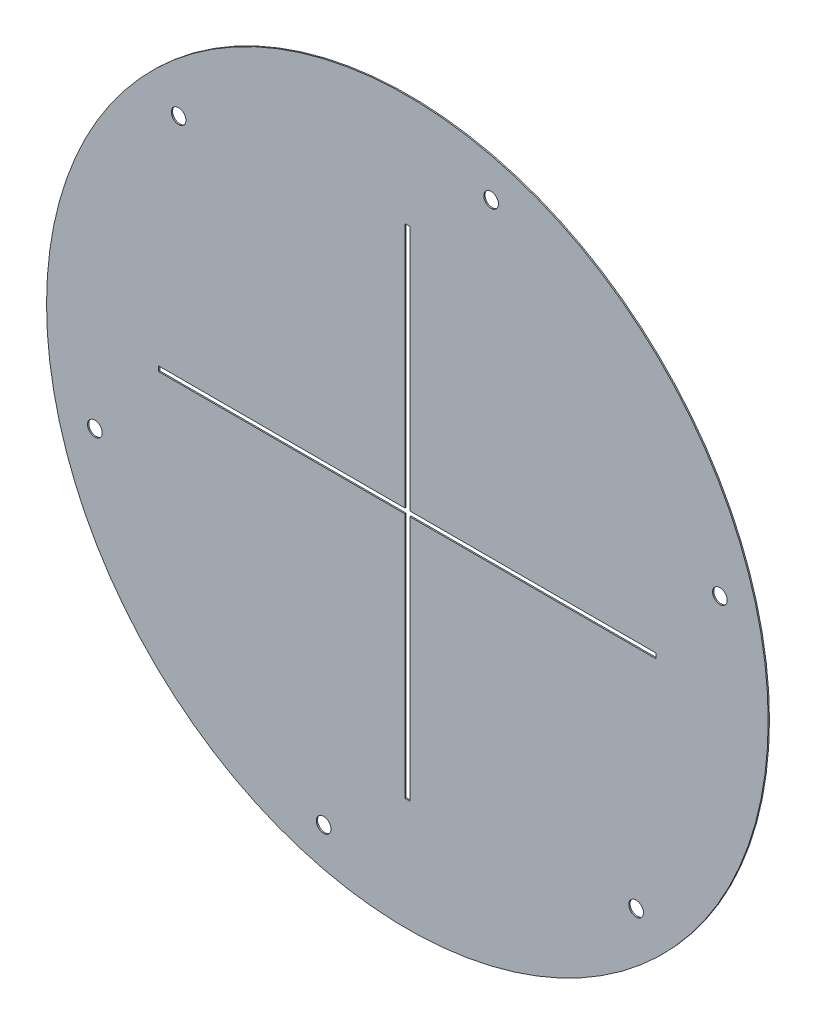
ISO-10303-21;
HEADER;
FILE_DESCRIPTION(('STEP AP214'),'2;1');
FILE_NAME('part.step','',(''),(''),'','','');
FILE_SCHEMA(('AUTOMOTIVE_DESIGN { 1 0 10303 214 1 1 1 1 }'));
ENDSEC;
DATA;
#1=APPLICATION_CONTEXT('core data for automotive mechanical design processes');
#2=APPLICATION_PROTOCOL_DEFINITION('international standard','automotive_design',2000,#1);
#3=PRODUCT_CONTEXT('',#1,'mechanical');
#4=PRODUCT('Part','Part','',(#3));
#5=PRODUCT_RELATED_PRODUCT_CATEGORY('part','',(#4));
#6=PRODUCT_DEFINITION_FORMATION('','',#4);
#7=PRODUCT_DEFINITION_CONTEXT('part definition',#1,'design');
#8=PRODUCT_DEFINITION('design','',#6,#7);
#9=PRODUCT_DEFINITION_SHAPE('','',#8);
#10=(LENGTH_UNIT() NAMED_UNIT(*) SI_UNIT(.MILLI.,.METRE.));
#11=(NAMED_UNIT(*) PLANE_ANGLE_UNIT() SI_UNIT($,.RADIAN.));
#12=(NAMED_UNIT(*) SI_UNIT($,.STERADIAN.) SOLID_ANGLE_UNIT());
#13=UNCERTAINTY_MEASURE_WITH_UNIT(LENGTH_MEASURE(1.E-05),#10,'distance_accuracy_value','');
#14=(GEOMETRIC_REPRESENTATION_CONTEXT(3) GLOBAL_UNCERTAINTY_ASSIGNED_CONTEXT((#13)) GLOBAL_UNIT_ASSIGNED_CONTEXT((#10,
#11,#12)) REPRESENTATION_CONTEXT('',''));
#15=CARTESIAN_POINT('',(0.,0.,0.));
#16=DIRECTION('',(0.,0.,1.));
#17=DIRECTION('',(1.,0.,0.));
#18=AXIS2_PLACEMENT_3D('',#15,#16,#17);
#19=CARTESIAN_POINT('',(0.,0.,0.254));
#20=DIRECTION('',(0.,0.,1.));
#21=DIRECTION('',(1.,0.,0.));
#22=AXIS2_PLACEMENT_3D('',#19,#20,#21);
#23=PLANE('',#22);
#24=CARTESIAN_POINT('',(-45.9619407771256,45.9619407771255,0.254));
#25=DIRECTION('',(0.,0.,1.));
#26=DIRECTION('',(1.,0.,0.));
#27=AXIS2_PLACEMENT_3D('',#24,#25,#26);
#28=CIRCLE('',#27,1.47320000000002);
#29=CARTESIAN_POINT('',(-44.4887407771256,45.9619407771255,0.254));
#30=VERTEX_POINT('',#29);
#31=EDGE_CURVE('E252',#30,#30,#28,.T.);
#32=ORIENTED_EDGE('',*,*,#31,.F.);
#33=EDGE_LOOP('',(#32));
#34=FACE_BOUND('',#33,.T.);
#35=CARTESIAN_POINT('',(-16.8232379316637,-62.7851787087894,0.254));
#36=DIRECTION('',(0.,0.,1.));
#37=DIRECTION('',(1.,0.,0.));
#38=AXIS2_PLACEMENT_3D('',#35,#36,#37);
#39=CIRCLE('',#38,1.47320000000002);
#40=CARTESIAN_POINT('',(-15.3500379316637,-62.7851787087894,0.254));
#41=VERTEX_POINT('',#40);
#42=EDGE_CURVE('E255',#41,#41,#39,.T.);
#43=ORIENTED_EDGE('',*,*,#42,.F.);
#44=EDGE_LOOP('',(#43));
#45=FACE_BOUND('',#44,.T.);
#46=DIRECTION('',(0.,-1.,0.));
#47=VECTOR('',#46,1.);
#48=CARTESIAN_POINT('',(-0.500000000000014,50.,0.254));
#49=LINE('',#48,#47);
#50=CARTESIAN_POINT('',(-0.500000000000014,50.,0.254));
#51=VERTEX_POINT('',#50);
#52=CARTESIAN_POINT('',(-0.499999999999997,0.5,0.254));
#53=VERTEX_POINT('',#52);
#54=EDGE_CURVE('E136',#51,#53,#49,.T.);
#55=ORIENTED_EDGE('',*,*,#54,.F.);
#56=DIRECTION('',(-1.,0.,0.));
#57=VECTOR('',#56,1.);
#58=CARTESIAN_POINT('',(0.499999999999986,50.,0.254));
#59=LINE('',#58,#57);
#60=CARTESIAN_POINT('',(0.499999999999986,50.,0.254));
#61=VERTEX_POINT('',#60);
#62=EDGE_CURVE('E128',#61,#51,#59,.T.);
#63=ORIENTED_EDGE('',*,*,#62,.F.);
#64=DIRECTION('',(0.,1.,0.));
#65=VECTOR('',#64,1.);
#66=CARTESIAN_POINT('',(0.500000000000002,0.499999999999999,0.254));
#67=LINE('',#66,#65);
#68=CARTESIAN_POINT('',(0.500000000000002,0.499999999999999,0.254));
#69=VERTEX_POINT('',#68);
#70=EDGE_CURVE('E171',#69,#61,#67,.T.);
#71=ORIENTED_EDGE('',*,*,#70,.F.);
#72=DIRECTION('',(-1.,0.,0.));
#73=VECTOR('',#72,1.);
#74=CARTESIAN_POINT('',(50.,0.499999999999999,0.254));
#75=LINE('',#74,#73);
#76=CARTESIAN_POINT('',(50.,0.499999999999999,0.254));
#77=VERTEX_POINT('',#76);
#78=EDGE_CURVE('E169',#77,#69,#75,.T.);
#79=ORIENTED_EDGE('',*,*,#78,.F.);
#80=DIRECTION('',(0.,1.,0.));
#81=VECTOR('',#80,1.);
#82=CARTESIAN_POINT('',(50.,-0.5,0.254));
#83=LINE('',#82,#81);
#84=CARTESIAN_POINT('',(50.,-0.5,0.254));
#85=VERTEX_POINT('',#84);
#86=EDGE_CURVE('E167',#85,#77,#83,.T.);
#87=ORIENTED_EDGE('',*,*,#86,.F.);
#88=DIRECTION('',(1.,0.,0.));
#89=VECTOR('',#88,1.);
#90=CARTESIAN_POINT('',(0.500000000000002,-0.5,0.254));
#91=LINE('',#90,#89);
#92=CARTESIAN_POINT('',(0.500000000000002,-0.5,0.254));
#93=VERTEX_POINT('',#92);
#94=EDGE_CURVE('E165',#93,#85,#91,.T.);
#95=ORIENTED_EDGE('',*,*,#94,.F.);
#96=DIRECTION('',(0.,1.,0.));
#97=VECTOR('',#96,1.);
#98=CARTESIAN_POINT('',(0.500000000000002,-50.,0.254));
#99=LINE('',#98,#97);
#100=CARTESIAN_POINT('',(0.500000000000002,-50.,0.254));
#101=VERTEX_POINT('',#100);
#102=EDGE_CURVE('E163',#101,#93,#99,.T.);
#103=ORIENTED_EDGE('',*,*,#102,.F.);
#104=DIRECTION('',(1.,0.,0.));
#105=VECTOR('',#104,1.);
#106=CARTESIAN_POINT('',(-0.499999999999997,-50.,0.254));
#107=LINE('',#106,#105);
#108=CARTESIAN_POINT('',(-0.499999999999997,-50.,0.254));
#109=VERTEX_POINT('',#108);
#110=EDGE_CURVE('E161',#109,#101,#107,.T.);
#111=ORIENTED_EDGE('',*,*,#110,.F.);
#112=DIRECTION('',(0.,-1.,0.));
#113=VECTOR('',#112,1.);
#114=CARTESIAN_POINT('',(-0.499999999999997,-0.5,0.254));
#115=LINE('',#114,#113);
#116=CARTESIAN_POINT('',(-0.499999999999997,-0.5,0.254));
#117=VERTEX_POINT('',#116);
#118=EDGE_CURVE('E159',#117,#109,#115,.T.);
#119=ORIENTED_EDGE('',*,*,#118,.F.);
#120=DIRECTION('',(1.,0.,0.));
#121=VECTOR('',#120,1.);
#122=CARTESIAN_POINT('',(-50.,-0.5,0.254));
#123=LINE('',#122,#121);
#124=CARTESIAN_POINT('',(-50.,-0.5,0.254));
#125=VERTEX_POINT('',#124);
#126=EDGE_CURVE('E157',#125,#117,#123,.T.);
#127=ORIENTED_EDGE('',*,*,#126,.F.);
#128=DIRECTION('',(0.,-1.,0.));
#129=VECTOR('',#128,1.);
#130=CARTESIAN_POINT('',(-50.,0.5,0.254));
#131=LINE('',#130,#129);
#132=CARTESIAN_POINT('',(-50.,0.5,0.254));
#133=VERTEX_POINT('',#132);
#134=EDGE_CURVE('E152',#133,#125,#131,.T.);
#135=ORIENTED_EDGE('',*,*,#134,.F.);
#136=DIRECTION('',(-1.,0.,0.));
#137=VECTOR('',#136,1.);
#138=CARTESIAN_POINT('',(-0.499999999999997,0.5,0.254));
#139=LINE('',#138,#137);
#140=EDGE_CURVE('E150',#53,#133,#139,.T.);
#141=ORIENTED_EDGE('',*,*,#140,.F.);
#142=EDGE_LOOP('',(#55,#63,#71,#79,#87,#95,#103,#111,#119,#127,#135,#141));
#143=FACE_BOUND('',#142,.T.);
#144=CARTESIAN_POINT('',(62.7851787087894,16.8232379316639,0.254));
#145=DIRECTION('',(0.,0.,1.));
#146=DIRECTION('',(1.,0.,0.));
#147=AXIS2_PLACEMENT_3D('',#144,#145,#146);
#148=CIRCLE('',#147,1.47320000000001);
#149=CARTESIAN_POINT('',(64.2583787087894,16.8232379316639,0.254));
#150=VERTEX_POINT('',#149);
#151=EDGE_CURVE('E224',#150,#150,#148,.T.);
#152=ORIENTED_EDGE('',*,*,#151,.F.);
#153=EDGE_LOOP('',(#152));
#154=FACE_BOUND('',#153,.T.);
#155=CARTESIAN_POINT('',(0.,0.,0.254));
#156=DIRECTION('',(0.,0.,1.));
#157=DIRECTION('',(1.,0.,0.));
#158=AXIS2_PLACEMENT_3D('',#155,#156,#157);
#159=CIRCLE('',#158,72.5);
#160=CARTESIAN_POINT('',(72.5,0.,0.254));
#161=VERTEX_POINT('',#160);
#162=EDGE_CURVE('E11',#161,#161,#159,.T.);
#163=ORIENTED_EDGE('',*,*,#162,.T.);
#164=EDGE_LOOP('',(#163));
#165=FACE_BOUND('',#164,.T.);
#166=CARTESIAN_POINT('',(-62.7851787087894,-16.8232379316639,0.254));
#167=DIRECTION('',(0.,0.,1.));
#168=DIRECTION('',(1.,0.,0.));
#169=AXIS2_PLACEMENT_3D('',#166,#167,#168);
#170=CIRCLE('',#169,1.4732);
#171=CARTESIAN_POINT('',(-61.3119787087894,-16.8232379316639,0.254));
#172=VERTEX_POINT('',#171);
#173=EDGE_CURVE('E174',#172,#172,#170,.T.);
#174=ORIENTED_EDGE('',*,*,#173,.F.);
#175=EDGE_LOOP('',(#174));
#176=FACE_BOUND('',#175,.T.);
#177=CARTESIAN_POINT('',(16.8232379316638,62.7851787087894,0.254));
#178=DIRECTION('',(0.,0.,1.));
#179=DIRECTION('',(1.,0.,0.));
#180=AXIS2_PLACEMENT_3D('',#177,#178,#179);
#181=CIRCLE('',#180,1.4732);
#182=CARTESIAN_POINT('',(18.2964379316638,62.7851787087894,0.254));
#183=VERTEX_POINT('',#182);
#184=EDGE_CURVE('E262',#183,#183,#181,.T.);
#185=ORIENTED_EDGE('',*,*,#184,.F.);
#186=EDGE_LOOP('',(#185));
#187=FACE_BOUND('',#186,.T.);
#188=CARTESIAN_POINT('',(45.9619407771256,-45.9619407771255,0.254));
#189=DIRECTION('',(0.,0.,1.));
#190=DIRECTION('',(1.,0.,0.));
#191=AXIS2_PLACEMENT_3D('',#188,#189,#190);
#192=CIRCLE('',#191,1.4732);
#193=CARTESIAN_POINT('',(47.4351407771256,-45.9619407771255,0.254));
#194=VERTEX_POINT('',#193);
#195=EDGE_CURVE('E280',#194,#194,#192,.T.);
#196=ORIENTED_EDGE('',*,*,#195,.F.);
#197=EDGE_LOOP('',(#196));
#198=FACE_BOUND('',#197,.T.);
#199=ADVANCED_FACE('F39',(#34,#45,#143,#154,#165,#176,#187,#198),#23,.T.);
#200=CARTESIAN_POINT('',(0.,0.,0.));
#201=DIRECTION('',(0.,0.,1.));
#202=DIRECTION('',(1.,0.,0.));
#203=AXIS2_PLACEMENT_3D('',#200,#201,#202);
#204=PLANE('',#203);
#205=CARTESIAN_POINT('',(62.7851787087894,16.8232379316639,0.));
#206=DIRECTION('',(0.,0.,1.));
#207=DIRECTION('',(1.,0.,0.));
#208=AXIS2_PLACEMENT_3D('',#205,#206,#207);
#209=CIRCLE('',#208,1.47320000000001);
#210=CARTESIAN_POINT('',(64.2583787087894,16.8232379316639,0.));
#211=VERTEX_POINT('',#210);
#212=EDGE_CURVE('E144',#211,#211,#209,.T.);
#213=ORIENTED_EDGE('',*,*,#212,.T.);
#214=EDGE_LOOP('',(#213));
#215=FACE_BOUND('',#214,.T.);
#216=CARTESIAN_POINT('',(0.,0.,0.));
#217=DIRECTION('',(0.,0.,1.));
#218=DIRECTION('',(1.,0.,0.));
#219=AXIS2_PLACEMENT_3D('',#216,#217,#218);
#220=CIRCLE('',#219,72.5);
#221=CARTESIAN_POINT('',(72.5,0.,0.));
#222=VERTEX_POINT('',#221);
#223=EDGE_CURVE('E43',#222,#222,#220,.T.);
#224=ORIENTED_EDGE('',*,*,#223,.F.);
#225=EDGE_LOOP('',(#224));
#226=FACE_BOUND('',#225,.T.);
#227=DIRECTION('',(-1.,0.,0.));
#228=VECTOR('',#227,1.);
#229=CARTESIAN_POINT('',(0.499999999999986,50.,0.));
#230=LINE('',#229,#228);
#231=CARTESIAN_POINT('',(0.499999999999986,50.,0.));
#232=VERTEX_POINT('',#231);
#233=CARTESIAN_POINT('',(-0.500000000000014,50.,0.));
#234=VERTEX_POINT('',#233);
#235=EDGE_CURVE('E62',#232,#234,#230,.T.);
#236=ORIENTED_EDGE('',*,*,#235,.T.);
#237=DIRECTION('',(0.,-1.,0.));
#238=VECTOR('',#237,1.);
#239=CARTESIAN_POINT('',(-0.500000000000014,50.,0.));
#240=LINE('',#239,#238);
#241=CARTESIAN_POINT('',(-0.499999999999997,0.5,0.));
#242=VERTEX_POINT('',#241);
#243=EDGE_CURVE('E143',#234,#242,#240,.T.);
#244=ORIENTED_EDGE('',*,*,#243,.T.);
#245=DIRECTION('',(-1.,0.,0.));
#246=VECTOR('',#245,1.);
#247=CARTESIAN_POINT('',(-0.499999999999997,0.5,0.));
#248=LINE('',#247,#246);
#249=CARTESIAN_POINT('',(-50.,0.5,0.));
#250=VERTEX_POINT('',#249);
#251=EDGE_CURVE('E176',#242,#250,#248,.T.);
#252=ORIENTED_EDGE('',*,*,#251,.T.);
#253=DIRECTION('',(0.,-1.,0.));
#254=VECTOR('',#253,1.);
#255=CARTESIAN_POINT('',(-50.,0.5,0.));
#256=LINE('',#255,#254);
#257=CARTESIAN_POINT('',(-50.,-0.5,0.));
#258=VERTEX_POINT('',#257);
#259=EDGE_CURVE('E179',#250,#258,#256,.T.);
#260=ORIENTED_EDGE('',*,*,#259,.T.);
#261=DIRECTION('',(1.,0.,0.));
#262=VECTOR('',#261,1.);
#263=CARTESIAN_POINT('',(-50.,-0.5,0.));
#264=LINE('',#263,#262);
#265=CARTESIAN_POINT('',(-0.499999999999997,-0.5,0.));
#266=VERTEX_POINT('',#265);
#267=EDGE_CURVE('E182',#258,#266,#264,.T.);
#268=ORIENTED_EDGE('',*,*,#267,.T.);
#269=DIRECTION('',(0.,-1.,0.));
#270=VECTOR('',#269,1.);
#271=CARTESIAN_POINT('',(-0.499999999999997,-0.5,0.));
#272=LINE('',#271,#270);
#273=CARTESIAN_POINT('',(-0.499999999999997,-50.,0.));
#274=VERTEX_POINT('',#273);
#275=EDGE_CURVE('E185',#266,#274,#272,.T.);
#276=ORIENTED_EDGE('',*,*,#275,.T.);
#277=DIRECTION('',(1.,0.,0.));
#278=VECTOR('',#277,1.);
#279=CARTESIAN_POINT('',(-0.499999999999997,-50.,0.));
#280=LINE('',#279,#278);
#281=CARTESIAN_POINT('',(0.500000000000002,-50.,0.));
#282=VERTEX_POINT('',#281);
#283=EDGE_CURVE('E188',#274,#282,#280,.T.);
#284=ORIENTED_EDGE('',*,*,#283,.T.);
#285=DIRECTION('',(0.,1.,0.));
#286=VECTOR('',#285,1.);
#287=CARTESIAN_POINT('',(0.500000000000002,-50.,0.));
#288=LINE('',#287,#286);
#289=CARTESIAN_POINT('',(0.500000000000002,-0.5,0.));
#290=VERTEX_POINT('',#289);
#291=EDGE_CURVE('E191',#282,#290,#288,.T.);
#292=ORIENTED_EDGE('',*,*,#291,.T.);
#293=DIRECTION('',(1.,0.,0.));
#294=VECTOR('',#293,1.);
#295=CARTESIAN_POINT('',(0.500000000000002,-0.5,0.));
#296=LINE('',#295,#294);
#297=CARTESIAN_POINT('',(50.,-0.5,0.));
#298=VERTEX_POINT('',#297);
#299=EDGE_CURVE('E194',#290,#298,#296,.T.);
#300=ORIENTED_EDGE('',*,*,#299,.T.);
#301=DIRECTION('',(0.,1.,0.));
#302=VECTOR('',#301,1.);
#303=CARTESIAN_POINT('',(50.,-0.5,0.));
#304=LINE('',#303,#302);
#305=CARTESIAN_POINT('',(50.,0.499999999999999,0.));
#306=VERTEX_POINT('',#305);
#307=EDGE_CURVE('E197',#298,#306,#304,.T.);
#308=ORIENTED_EDGE('',*,*,#307,.T.);
#309=DIRECTION('',(-1.,0.,0.));
#310=VECTOR('',#309,1.);
#311=CARTESIAN_POINT('',(50.,0.499999999999999,0.));
#312=LINE('',#311,#310);
#313=CARTESIAN_POINT('',(0.500000000000002,0.499999999999999,0.));
#314=VERTEX_POINT('',#313);
#315=EDGE_CURVE('E200',#306,#314,#312,.T.);
#316=ORIENTED_EDGE('',*,*,#315,.T.);
#317=DIRECTION('',(0.,1.,0.));
#318=VECTOR('',#317,1.);
#319=CARTESIAN_POINT('',(0.500000000000002,0.499999999999999,0.));
#320=LINE('',#319,#318);
#321=EDGE_CURVE('E137',#314,#232,#320,.T.);
#322=ORIENTED_EDGE('',*,*,#321,.T.);
#323=EDGE_LOOP('',(#236,#244,#252,#260,#268,#276,#284,#292,#300,#308,#316,#322));
#324=FACE_BOUND('',#323,.T.);
#325=CARTESIAN_POINT('',(-62.7851787087894,-16.8232379316639,0.));
#326=DIRECTION('',(0.,0.,1.));
#327=DIRECTION('',(1.,0.,0.));
#328=AXIS2_PLACEMENT_3D('',#325,#326,#327);
#329=CIRCLE('',#328,1.4732);
#330=CARTESIAN_POINT('',(-61.3119787087894,-16.8232379316639,0.));
#331=VERTEX_POINT('',#330);
#332=EDGE_CURVE('E257',#331,#331,#329,.T.);
#333=ORIENTED_EDGE('',*,*,#332,.T.);
#334=EDGE_LOOP('',(#333));
#335=FACE_BOUND('',#334,.T.);
#336=CARTESIAN_POINT('',(-16.8232379316637,-62.7851787087894,0.));
#337=DIRECTION('',(0.,0.,1.));
#338=DIRECTION('',(1.,0.,0.));
#339=AXIS2_PLACEMENT_3D('',#336,#337,#338);
#340=CIRCLE('',#339,1.47320000000002);
#341=CARTESIAN_POINT('',(-15.3500379316637,-62.7851787087894,0.));
#342=VERTEX_POINT('',#341);
#343=EDGE_CURVE('E258',#342,#342,#340,.T.);
#344=ORIENTED_EDGE('',*,*,#343,.T.);
#345=EDGE_LOOP('',(#344));
#346=FACE_BOUND('',#345,.T.);
#347=CARTESIAN_POINT('',(16.8232379316638,62.7851787087894,0.));
#348=DIRECTION('',(0.,0.,1.));
#349=DIRECTION('',(1.,0.,0.));
#350=AXIS2_PLACEMENT_3D('',#347,#348,#349);
#351=CIRCLE('',#350,1.4732);
#352=CARTESIAN_POINT('',(18.2964379316638,62.7851787087894,0.));
#353=VERTEX_POINT('',#352);
#354=EDGE_CURVE('E265',#353,#353,#351,.T.);
#355=ORIENTED_EDGE('',*,*,#354,.T.);
#356=EDGE_LOOP('',(#355));
#357=FACE_BOUND('',#356,.T.);
#358=CARTESIAN_POINT('',(-45.9619407771256,45.9619407771255,0.));
#359=DIRECTION('',(0.,0.,1.));
#360=DIRECTION('',(1.,0.,0.));
#361=AXIS2_PLACEMENT_3D('',#358,#359,#360);
#362=CIRCLE('',#361,1.47320000000002);
#363=CARTESIAN_POINT('',(-44.4887407771256,45.9619407771255,0.));
#364=VERTEX_POINT('',#363);
#365=EDGE_CURVE('E282',#364,#364,#362,.T.);
#366=ORIENTED_EDGE('',*,*,#365,.T.);
#367=EDGE_LOOP('',(#366));
#368=FACE_BOUND('',#367,.T.);
#369=CARTESIAN_POINT('',(45.9619407771256,-45.9619407771255,0.));
#370=DIRECTION('',(0.,0.,1.));
#371=DIRECTION('',(1.,0.,0.));
#372=AXIS2_PLACEMENT_3D('',#369,#370,#371);
#373=CIRCLE('',#372,1.4732);
#374=CARTESIAN_POINT('',(47.4351407771256,-45.9619407771255,0.));
#375=VERTEX_POINT('',#374);
#376=EDGE_CURVE('E283',#375,#375,#373,.T.);
#377=ORIENTED_EDGE('',*,*,#376,.T.);
#378=EDGE_LOOP('',(#377));
#379=FACE_BOUND('',#378,.T.);
#380=ADVANCED_FACE('F230',(#215,#226,#324,#335,#346,#357,#368,#379),#204,.F.);
#381=CARTESIAN_POINT('',(0.,0.,0.254));
#382=DIRECTION('',(0.,0.,-1.));
#383=DIRECTION('',(-1.,0.,0.));
#384=AXIS2_PLACEMENT_3D('',#381,#382,#383);
#385=CYLINDRICAL_SURFACE('',#384,72.5);
#386=ORIENTED_EDGE('',*,*,#162,.F.);
#387=EDGE_LOOP('',(#386));
#388=FACE_BOUND('',#387,.T.);
#389=ORIENTED_EDGE('',*,*,#223,.T.);
#390=EDGE_LOOP('',(#389));
#391=FACE_BOUND('',#390,.T.);
#392=ADVANCED_FACE('F41',(#388,#391),#385,.T.);
#393=CARTESIAN_POINT('',(62.7851787087894,16.8232379316639,0.254));
#394=DIRECTION('',(0.,0.,-1.));
#395=DIRECTION('',(-1.,0.,0.));
#396=AXIS2_PLACEMENT_3D('',#393,#394,#395);
#397=CYLINDRICAL_SURFACE('',#396,1.47320000000001);
#398=ORIENTED_EDGE('',*,*,#151,.T.);
#399=EDGE_LOOP('',(#398));
#400=FACE_BOUND('',#399,.T.);
#401=ORIENTED_EDGE('',*,*,#212,.F.);
#402=EDGE_LOOP('',(#401));
#403=FACE_BOUND('',#402,.T.);
#404=ADVANCED_FACE('F233',(#400,#403),#397,.F.);
#405=CARTESIAN_POINT('',(0.499999999999986,50.,0.254));
#406=DIRECTION('',(0.,-1.,0.));
#407=DIRECTION('',(0.,0.,-1.));
#408=AXIS2_PLACEMENT_3D('',#405,#406,#407);
#409=PLANE('',#408);
#410=ORIENTED_EDGE('',*,*,#235,.F.);
#411=DIRECTION('',(0.,0.,-1.));
#412=VECTOR('',#411,1.);
#413=CARTESIAN_POINT('',(0.499999999999986,50.,0.254));
#414=LINE('',#413,#412);
#415=EDGE_CURVE('E132',#61,#232,#414,.T.);
#416=ORIENTED_EDGE('',*,*,#415,.F.);
#417=ORIENTED_EDGE('',*,*,#62,.T.);
#418=DIRECTION('',(0.,0.,-1.));
#419=VECTOR('',#418,1.);
#420=CARTESIAN_POINT('',(-0.500000000000014,50.,0.254));
#421=LINE('',#420,#419);
#422=EDGE_CURVE('E131',#51,#234,#421,.T.);
#423=ORIENTED_EDGE('',*,*,#422,.T.);
#424=EDGE_LOOP('',(#410,#416,#417,#423));
#425=FACE_BOUND('',#424,.T.);
#426=ADVANCED_FACE('F130',(#425),#409,.T.);
#427=CARTESIAN_POINT('',(-0.500000000000014,50.,0.254));
#428=DIRECTION('',(1.,0.,0.));
#429=DIRECTION('',(0.,1.,0.));
#430=AXIS2_PLACEMENT_3D('',#427,#428,#429);
#431=PLANE('',#430);
#432=ORIENTED_EDGE('',*,*,#243,.F.);
#433=ORIENTED_EDGE('',*,*,#422,.F.);
#434=ORIENTED_EDGE('',*,*,#54,.T.);
#435=DIRECTION('',(0.,0.,-1.));
#436=VECTOR('',#435,1.);
#437=CARTESIAN_POINT('',(-0.499999999999997,0.5,0.254));
#438=LINE('',#437,#436);
#439=EDGE_CURVE('E145',#53,#242,#438,.T.);
#440=ORIENTED_EDGE('',*,*,#439,.T.);
#441=EDGE_LOOP('',(#432,#433,#434,#440));
#442=FACE_BOUND('',#441,.T.);
#443=ADVANCED_FACE('F140',(#442),#431,.T.);
#444=CARTESIAN_POINT('',(-0.499999999999997,0.5,0.254));
#445=DIRECTION('',(0.,-1.,0.));
#446=DIRECTION('',(0.,0.,-1.));
#447=AXIS2_PLACEMENT_3D('',#444,#445,#446);
#448=PLANE('',#447);
#449=ORIENTED_EDGE('',*,*,#251,.F.);
#450=ORIENTED_EDGE('',*,*,#439,.F.);
#451=ORIENTED_EDGE('',*,*,#140,.T.);
#452=DIRECTION('',(0.,0.,-1.));
#453=VECTOR('',#452,1.);
#454=CARTESIAN_POINT('',(-50.,0.5,0.254));
#455=LINE('',#454,#453);
#456=EDGE_CURVE('E221',#133,#250,#455,.T.);
#457=ORIENTED_EDGE('',*,*,#456,.T.);
#458=EDGE_LOOP('',(#449,#450,#451,#457));
#459=FACE_BOUND('',#458,.T.);
#460=ADVANCED_FACE('F347',(#459),#448,.T.);
#461=CARTESIAN_POINT('',(-50.,0.5,0.254));
#462=DIRECTION('',(1.,0.,0.));
#463=DIRECTION('',(0.,0.,-1.));
#464=AXIS2_PLACEMENT_3D('',#461,#462,#463);
#465=PLANE('',#464);
#466=ORIENTED_EDGE('',*,*,#259,.F.);
#467=ORIENTED_EDGE('',*,*,#456,.F.);
#468=ORIENTED_EDGE('',*,*,#134,.T.);
#469=DIRECTION('',(0.,0.,-1.));
#470=VECTOR('',#469,1.);
#471=CARTESIAN_POINT('',(-50.,-0.5,0.254));
#472=LINE('',#471,#470);
#473=EDGE_CURVE('E219',#125,#258,#472,.T.);
#474=ORIENTED_EDGE('',*,*,#473,.T.);
#475=EDGE_LOOP('',(#466,#467,#468,#474));
#476=FACE_BOUND('',#475,.T.);
#477=ADVANCED_FACE('F343',(#476),#465,.T.);
#478=CARTESIAN_POINT('',(-50.,-0.5,0.254));
#479=DIRECTION('',(0.,1.,0.));
#480=DIRECTION('',(0.,0.,1.));
#481=AXIS2_PLACEMENT_3D('',#478,#479,#480);
#482=PLANE('',#481);
#483=ORIENTED_EDGE('',*,*,#267,.F.);
#484=ORIENTED_EDGE('',*,*,#473,.F.);
#485=ORIENTED_EDGE('',*,*,#126,.T.);
#486=DIRECTION('',(0.,0.,-1.));
#487=VECTOR('',#486,1.);
#488=CARTESIAN_POINT('',(-0.499999999999997,-0.5,0.254));
#489=LINE('',#488,#487);
#490=EDGE_CURVE('E217',#117,#266,#489,.T.);
#491=ORIENTED_EDGE('',*,*,#490,.T.);
#492=EDGE_LOOP('',(#483,#484,#485,#491));
#493=FACE_BOUND('',#492,.T.);
#494=ADVANCED_FACE('F339',(#493),#482,.T.);
#495=CARTESIAN_POINT('',(-0.499999999999997,-0.5,0.254));
#496=DIRECTION('',(1.,0.,0.));
#497=DIRECTION('',(0.,0.,-1.));
#498=AXIS2_PLACEMENT_3D('',#495,#496,#497);
#499=PLANE('',#498);
#500=ORIENTED_EDGE('',*,*,#275,.F.);
#501=ORIENTED_EDGE('',*,*,#490,.F.);
#502=ORIENTED_EDGE('',*,*,#118,.T.);
#503=DIRECTION('',(0.,0.,-1.));
#504=VECTOR('',#503,1.);
#505=CARTESIAN_POINT('',(-0.499999999999997,-50.,0.254));
#506=LINE('',#505,#504);
#507=EDGE_CURVE('E215',#109,#274,#506,.T.);
#508=ORIENTED_EDGE('',*,*,#507,.T.);
#509=EDGE_LOOP('',(#500,#501,#502,#508));
#510=FACE_BOUND('',#509,.T.);
#511=ADVANCED_FACE('F335',(#510),#499,.T.);
#512=CARTESIAN_POINT('',(-0.499999999999997,-50.,0.254));
#513=DIRECTION('',(0.,1.,0.));
#514=DIRECTION('',(0.,0.,1.));
#515=AXIS2_PLACEMENT_3D('',#512,#513,#514);
#516=PLANE('',#515);
#517=ORIENTED_EDGE('',*,*,#283,.F.);
#518=ORIENTED_EDGE('',*,*,#507,.F.);
#519=ORIENTED_EDGE('',*,*,#110,.T.);
#520=DIRECTION('',(0.,0.,-1.));
#521=VECTOR('',#520,1.);
#522=CARTESIAN_POINT('',(0.500000000000002,-50.,0.254));
#523=LINE('',#522,#521);
#524=EDGE_CURVE('E213',#101,#282,#523,.T.);
#525=ORIENTED_EDGE('',*,*,#524,.T.);
#526=EDGE_LOOP('',(#517,#518,#519,#525));
#527=FACE_BOUND('',#526,.T.);
#528=ADVANCED_FACE('F331',(#527),#516,.T.);
#529=CARTESIAN_POINT('',(0.500000000000002,-50.,0.254));
#530=DIRECTION('',(-1.,0.,0.));
#531=DIRECTION('',(0.,0.,1.));
#532=AXIS2_PLACEMENT_3D('',#529,#530,#531);
#533=PLANE('',#532);
#534=ORIENTED_EDGE('',*,*,#291,.F.);
#535=ORIENTED_EDGE('',*,*,#524,.F.);
#536=ORIENTED_EDGE('',*,*,#102,.T.);
#537=DIRECTION('',(0.,0.,-1.));
#538=VECTOR('',#537,1.);
#539=CARTESIAN_POINT('',(0.500000000000002,-0.5,0.254));
#540=LINE('',#539,#538);
#541=EDGE_CURVE('E211',#93,#290,#540,.T.);
#542=ORIENTED_EDGE('',*,*,#541,.T.);
#543=EDGE_LOOP('',(#534,#535,#536,#542));
#544=FACE_BOUND('',#543,.T.);
#545=ADVANCED_FACE('F327',(#544),#533,.T.);
#546=CARTESIAN_POINT('',(0.500000000000002,-0.5,0.254));
#547=DIRECTION('',(0.,1.,0.));
#548=DIRECTION('',(0.,0.,1.));
#549=AXIS2_PLACEMENT_3D('',#546,#547,#548);
#550=PLANE('',#549);
#551=ORIENTED_EDGE('',*,*,#299,.F.);
#552=ORIENTED_EDGE('',*,*,#541,.F.);
#553=ORIENTED_EDGE('',*,*,#94,.T.);
#554=DIRECTION('',(0.,0.,-1.));
#555=VECTOR('',#554,1.);
#556=CARTESIAN_POINT('',(50.,-0.5,0.254));
#557=LINE('',#556,#555);
#558=EDGE_CURVE('E209',#85,#298,#557,.T.);
#559=ORIENTED_EDGE('',*,*,#558,.T.);
#560=EDGE_LOOP('',(#551,#552,#553,#559));
#561=FACE_BOUND('',#560,.T.);
#562=ADVANCED_FACE('F323',(#561),#550,.T.);
#563=CARTESIAN_POINT('',(50.,-0.5,0.254));
#564=DIRECTION('',(-1.,0.,0.));
#565=DIRECTION('',(0.,0.,1.));
#566=AXIS2_PLACEMENT_3D('',#563,#564,#565);
#567=PLANE('',#566);
#568=ORIENTED_EDGE('',*,*,#307,.F.);
#569=ORIENTED_EDGE('',*,*,#558,.F.);
#570=ORIENTED_EDGE('',*,*,#86,.T.);
#571=DIRECTION('',(0.,0.,-1.));
#572=VECTOR('',#571,1.);
#573=CARTESIAN_POINT('',(50.,0.499999999999999,0.254));
#574=LINE('',#573,#572);
#575=EDGE_CURVE('E207',#77,#306,#574,.T.);
#576=ORIENTED_EDGE('',*,*,#575,.T.);
#577=EDGE_LOOP('',(#568,#569,#570,#576));
#578=FACE_BOUND('',#577,.T.);
#579=ADVANCED_FACE('F319',(#578),#567,.T.);
#580=CARTESIAN_POINT('',(50.,0.499999999999999,0.254));
#581=DIRECTION('',(0.,-1.,0.));
#582=DIRECTION('',(0.,0.,-1.));
#583=AXIS2_PLACEMENT_3D('',#580,#581,#582);
#584=PLANE('',#583);
#585=ORIENTED_EDGE('',*,*,#315,.F.);
#586=ORIENTED_EDGE('',*,*,#575,.F.);
#587=ORIENTED_EDGE('',*,*,#78,.T.);
#588=DIRECTION('',(0.,0.,-1.));
#589=VECTOR('',#588,1.);
#590=CARTESIAN_POINT('',(0.500000000000002,0.499999999999999,0.254));
#591=LINE('',#590,#589);
#592=EDGE_CURVE('E54',#69,#314,#591,.T.);
#593=ORIENTED_EDGE('',*,*,#592,.T.);
#594=EDGE_LOOP('',(#585,#586,#587,#593));
#595=FACE_BOUND('',#594,.T.);
#596=ADVANCED_FACE('F316',(#595),#584,.T.);
#597=CARTESIAN_POINT('',(0.500000000000002,0.499999999999999,0.254));
#598=DIRECTION('',(-1.,0.,0.));
#599=DIRECTION('',(0.,-1.,0.));
#600=AXIS2_PLACEMENT_3D('',#597,#598,#599);
#601=PLANE('',#600);
#602=ORIENTED_EDGE('',*,*,#321,.F.);
#603=ORIENTED_EDGE('',*,*,#592,.F.);
#604=ORIENTED_EDGE('',*,*,#70,.T.);
#605=ORIENTED_EDGE('',*,*,#415,.T.);
#606=EDGE_LOOP('',(#602,#603,#604,#605));
#607=FACE_BOUND('',#606,.T.);
#608=ADVANCED_FACE('F313',(#607),#601,.T.);
#609=CARTESIAN_POINT('',(-62.7851787087894,-16.8232379316639,0.254));
#610=DIRECTION('',(0.,0.,-1.));
#611=DIRECTION('',(-1.,0.,0.));
#612=AXIS2_PLACEMENT_3D('',#609,#610,#611);
#613=CYLINDRICAL_SURFACE('',#612,1.4732);
#614=ORIENTED_EDGE('',*,*,#173,.T.);
#615=EDGE_LOOP('',(#614));
#616=FACE_BOUND('',#615,.T.);
#617=ORIENTED_EDGE('',*,*,#332,.F.);
#618=EDGE_LOOP('',(#617));
#619=FACE_BOUND('',#618,.T.);
#620=ADVANCED_FACE('F271',(#616,#619),#613,.F.);
#621=CARTESIAN_POINT('',(-16.8232379316637,-62.7851787087894,0.254));
#622=DIRECTION('',(0.,0.,-1.));
#623=DIRECTION('',(-1.,0.,0.));
#624=AXIS2_PLACEMENT_3D('',#621,#622,#623);
#625=CYLINDRICAL_SURFACE('',#624,1.47320000000002);
#626=ORIENTED_EDGE('',*,*,#42,.T.);
#627=EDGE_LOOP('',(#626));
#628=FACE_BOUND('',#627,.T.);
#629=ORIENTED_EDGE('',*,*,#343,.F.);
#630=EDGE_LOOP('',(#629));
#631=FACE_BOUND('',#630,.T.);
#632=ADVANCED_FACE('F299',(#628,#631),#625,.F.);
#633=CARTESIAN_POINT('',(16.8232379316638,62.7851787087894,0.254));
#634=DIRECTION('',(0.,0.,-1.));
#635=DIRECTION('',(-1.,0.,0.));
#636=AXIS2_PLACEMENT_3D('',#633,#634,#635);
#637=CYLINDRICAL_SURFACE('',#636,1.4732);
#638=ORIENTED_EDGE('',*,*,#184,.T.);
#639=EDGE_LOOP('',(#638));
#640=FACE_BOUND('',#639,.T.);
#641=ORIENTED_EDGE('',*,*,#354,.F.);
#642=EDGE_LOOP('',(#641));
#643=FACE_BOUND('',#642,.T.);
#644=ADVANCED_FACE('F296',(#640,#643),#637,.F.);
#645=CARTESIAN_POINT('',(-45.9619407771256,45.9619407771255,0.254));
#646=DIRECTION('',(0.,0.,-1.));
#647=DIRECTION('',(-1.,0.,0.));
#648=AXIS2_PLACEMENT_3D('',#645,#646,#647);
#649=CYLINDRICAL_SURFACE('',#648,1.47320000000002);
#650=ORIENTED_EDGE('',*,*,#31,.T.);
#651=EDGE_LOOP('',(#650));
#652=FACE_BOUND('',#651,.T.);
#653=ORIENTED_EDGE('',*,*,#365,.F.);
#654=EDGE_LOOP('',(#653));
#655=FACE_BOUND('',#654,.T.);
#656=ADVANCED_FACE('F298',(#652,#655),#649,.F.);
#657=CARTESIAN_POINT('',(45.9619407771256,-45.9619407771255,0.254));
#658=DIRECTION('',(0.,0.,-1.));
#659=DIRECTION('',(-1.,0.,0.));
#660=AXIS2_PLACEMENT_3D('',#657,#658,#659);
#661=CYLINDRICAL_SURFACE('',#660,1.4732);
#662=ORIENTED_EDGE('',*,*,#195,.T.);
#663=EDGE_LOOP('',(#662));
#664=FACE_BOUND('',#663,.T.);
#665=ORIENTED_EDGE('',*,*,#376,.F.);
#666=EDGE_LOOP('',(#665));
#667=FACE_BOUND('',#666,.T.);
#668=ADVANCED_FACE('F305',(#664,#667),#661,.F.);
#669=CLOSED_SHELL('',(#199,#380,#392,#404,#426,#443,#460,#477,#494,#511,#528,#545,#562,#579,
#596,#608,#620,#632,#644,#656,#668));
#670=MANIFOLD_SOLID_BREP('B2',#669);
#671=ADVANCED_BREP_SHAPE_REPRESENTATION('',(#18,#670),#14);
#672=SHAPE_DEFINITION_REPRESENTATION(#9,#671);
ENDSEC;
END-ISO-10303-21;
